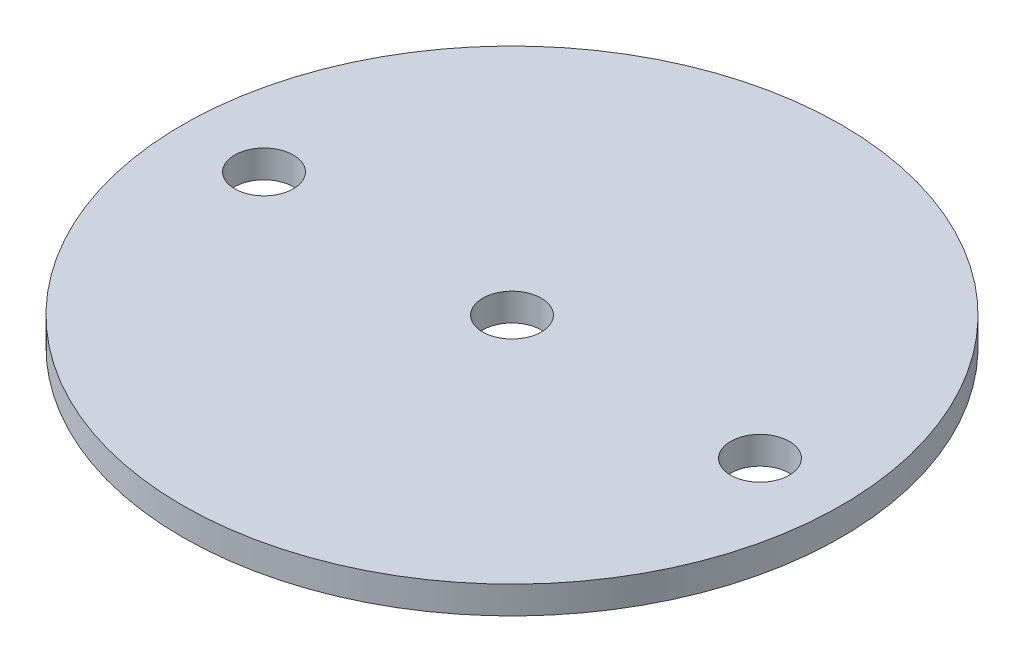
ISO-10303-21;
HEADER;
FILE_DESCRIPTION(('STEP AP214'),'2;1');
FILE_NAME('part.step','',(''),(''),'','','');
FILE_SCHEMA(('AUTOMOTIVE_DESIGN { 1 0 10303 214 1 1 1 1 }'));
ENDSEC;
DATA;
#1=APPLICATION_CONTEXT('core data for automotive mechanical design processes');
#2=APPLICATION_PROTOCOL_DEFINITION('international standard','automotive_design',2000,#1);
#3=PRODUCT_CONTEXT('',#1,'mechanical');
#4=PRODUCT('Part','Part','',(#3));
#5=PRODUCT_RELATED_PRODUCT_CATEGORY('part','',(#4));
#6=PRODUCT_DEFINITION_FORMATION('','',#4);
#7=PRODUCT_DEFINITION_CONTEXT('part definition',#1,'design');
#8=PRODUCT_DEFINITION('design','',#6,#7);
#9=PRODUCT_DEFINITION_SHAPE('','',#8);
#10=(LENGTH_UNIT() NAMED_UNIT(*) SI_UNIT(.MILLI.,.METRE.));
#11=(NAMED_UNIT(*) PLANE_ANGLE_UNIT() SI_UNIT($,.RADIAN.));
#12=(NAMED_UNIT(*) SI_UNIT($,.STERADIAN.) SOLID_ANGLE_UNIT());
#13=UNCERTAINTY_MEASURE_WITH_UNIT(LENGTH_MEASURE(1.E-05),#10,'distance_accuracy_value','');
#14=(GEOMETRIC_REPRESENTATION_CONTEXT(3) GLOBAL_UNCERTAINTY_ASSIGNED_CONTEXT((#13)) GLOBAL_UNIT_ASSIGNED_CONTEXT((#10,
#11,#12)) REPRESENTATION_CONTEXT('',''));
#15=CARTESIAN_POINT('',(0.,0.,0.));
#16=DIRECTION('',(0.,0.,1.));
#17=DIRECTION('',(1.,0.,0.));
#18=AXIS2_PLACEMENT_3D('',#15,#16,#17);
#19=CARTESIAN_POINT('',(0.,1.5875,0.));
#20=DIRECTION('',(0.,-1.,0.));
#21=DIRECTION('',(0.,0.,-1.));
#22=AXIS2_PLACEMENT_3D('',#19,#20,#21);
#23=CYLINDRICAL_SURFACE('',#22,37.973);
#24=CARTESIAN_POINT('',(0.,1.5875,0.));
#25=DIRECTION('',(0.,1.,0.));
#26=DIRECTION('',(0.,0.,1.));
#27=AXIS2_PLACEMENT_3D('',#24,#25,#26);
#28=CIRCLE('',#27,37.973);
#29=CARTESIAN_POINT('',(0.,1.5875,37.973));
#30=VERTEX_POINT('',#29);
#31=EDGE_CURVE('E10',#30,#30,#28,.T.);
#32=ORIENTED_EDGE('',*,*,#31,.F.);
#33=EDGE_LOOP('',(#32));
#34=FACE_BOUND('',#33,.T.);
#35=CARTESIAN_POINT('',(0.,-1.5875,0.));
#36=DIRECTION('',(0.,1.,0.));
#37=DIRECTION('',(0.,0.,1.));
#38=AXIS2_PLACEMENT_3D('',#35,#36,#37);
#39=CIRCLE('',#38,37.973);
#40=CARTESIAN_POINT('',(0.,-1.5875,37.973));
#41=VERTEX_POINT('',#40);
#42=EDGE_CURVE('E42',#41,#41,#39,.T.);
#43=ORIENTED_EDGE('',*,*,#42,.T.);
#44=EDGE_LOOP('',(#43));
#45=FACE_BOUND('',#44,.T.);
#46=ADVANCED_FACE('F39',(#34,#45),#23,.T.);
#47=CARTESIAN_POINT('',(0.,1.5875,0.));
#48=DIRECTION('',(0.,1.,0.));
#49=DIRECTION('',(0.,0.,1.));
#50=AXIS2_PLACEMENT_3D('',#47,#48,#49);
#51=PLANE('',#50);
#52=CARTESIAN_POINT('',(0.,1.5875,0.));
#53=DIRECTION('',(0.,1.,0.));
#54=DIRECTION('',(0.,0.,1.));
#55=AXIS2_PLACEMENT_3D('',#52,#53,#54);
#56=CIRCLE('',#55,3.3782);
#57=CARTESIAN_POINT('',(0.,1.5875,3.3782));
#58=VERTEX_POINT('',#57);
#59=EDGE_CURVE('E72',#58,#58,#56,.T.);
#60=ORIENTED_EDGE('',*,*,#59,.F.);
#61=EDGE_LOOP('',(#60));
#62=FACE_BOUND('',#61,.T.);
#63=CARTESIAN_POINT('',(-28.575,1.5875,0.));
#64=DIRECTION('',(0.,1.,0.));
#65=DIRECTION('',(0.,0.,1.));
#66=AXIS2_PLACEMENT_3D('',#63,#64,#65);
#67=CIRCLE('',#66,3.37819999999999);
#68=CARTESIAN_POINT('',(-28.575,1.5875,3.37819999999999));
#69=VERTEX_POINT('',#68);
#70=EDGE_CURVE('E64',#69,#69,#67,.T.);
#71=ORIENTED_EDGE('',*,*,#70,.F.);
#72=EDGE_LOOP('',(#71));
#73=FACE_BOUND('',#72,.T.);
#74=CARTESIAN_POINT('',(28.575,1.5875,0.));
#75=DIRECTION('',(0.,1.,0.));
#76=DIRECTION('',(0.,0.,1.));
#77=AXIS2_PLACEMENT_3D('',#74,#75,#76);
#78=CIRCLE('',#77,3.37819999999999);
#79=CARTESIAN_POINT('',(28.575,1.5875,3.37819999999998));
#80=VERTEX_POINT('',#79);
#81=EDGE_CURVE('E56',#80,#80,#78,.T.);
#82=ORIENTED_EDGE('',*,*,#81,.F.);
#83=EDGE_LOOP('',(#82));
#84=FACE_BOUND('',#83,.T.);
#85=ORIENTED_EDGE('',*,*,#31,.T.);
#86=EDGE_LOOP('',(#85));
#87=FACE_BOUND('',#86,.T.);
#88=ADVANCED_FACE('F79',(#62,#73,#84,#87),#51,.T.);
#89=CARTESIAN_POINT('',(0.,-1.5875,0.));
#90=DIRECTION('',(0.,1.,0.));
#91=DIRECTION('',(0.,0.,1.));
#92=AXIS2_PLACEMENT_3D('',#89,#90,#91);
#93=PLANE('',#92);
#94=CARTESIAN_POINT('',(0.,-1.5875,0.));
#95=DIRECTION('',(0.,1.,0.));
#96=DIRECTION('',(0.,0.,1.));
#97=AXIS2_PLACEMENT_3D('',#94,#95,#96);
#98=CIRCLE('',#97,3.3782);
#99=CARTESIAN_POINT('',(0.,-1.5875,3.3782));
#100=VERTEX_POINT('',#99);
#101=EDGE_CURVE('E68',#100,#100,#98,.T.);
#102=ORIENTED_EDGE('',*,*,#101,.T.);
#103=EDGE_LOOP('',(#102));
#104=FACE_BOUND('',#103,.T.);
#105=CARTESIAN_POINT('',(-28.575,-1.5875,0.));
#106=DIRECTION('',(0.,1.,0.));
#107=DIRECTION('',(0.,0.,1.));
#108=AXIS2_PLACEMENT_3D('',#105,#106,#107);
#109=CIRCLE('',#108,3.3782);
#110=CARTESIAN_POINT('',(-28.575,-1.5875,3.3782));
#111=VERTEX_POINT('',#110);
#112=EDGE_CURVE('E60',#111,#111,#109,.T.);
#113=ORIENTED_EDGE('',*,*,#112,.T.);
#114=EDGE_LOOP('',(#113));
#115=FACE_BOUND('',#114,.T.);
#116=CARTESIAN_POINT('',(28.575,-1.5875,0.));
#117=DIRECTION('',(0.,1.,0.));
#118=DIRECTION('',(0.,0.,1.));
#119=AXIS2_PLACEMENT_3D('',#116,#117,#118);
#120=CIRCLE('',#119,3.3782);
#121=CARTESIAN_POINT('',(28.575,-1.5875,3.37819999999999));
#122=VERTEX_POINT('',#121);
#123=EDGE_CURVE('E51',#122,#122,#120,.T.);
#124=ORIENTED_EDGE('',*,*,#123,.T.);
#125=EDGE_LOOP('',(#124));
#126=FACE_BOUND('',#125,.T.);
#127=ORIENTED_EDGE('',*,*,#42,.F.);
#128=EDGE_LOOP('',(#127));
#129=FACE_BOUND('',#128,.T.);
#130=ADVANCED_FACE('F82',(#104,#115,#126,#129),#93,.F.);
#131=CARTESIAN_POINT('',(28.575,1.5875,0.));
#132=DIRECTION('',(0.,1.,0.));
#133=DIRECTION('',(0.,0.,1.));
#134=AXIS2_PLACEMENT_3D('',#131,#132,#133);
#135=CYLINDRICAL_SURFACE('',#134,3.37819999999999);
#136=ORIENTED_EDGE('',*,*,#123,.F.);
#137=EDGE_LOOP('',(#136));
#138=FACE_BOUND('',#137,.T.);
#139=ORIENTED_EDGE('',*,*,#81,.T.);
#140=EDGE_LOOP('',(#139));
#141=FACE_BOUND('',#140,.T.);
#142=ADVANCED_FACE('F88',(#138,#141),#135,.F.);
#143=CARTESIAN_POINT('',(-28.575,1.5875,0.));
#144=DIRECTION('',(0.,1.,0.));
#145=DIRECTION('',(0.,0.,1.));
#146=AXIS2_PLACEMENT_3D('',#143,#144,#145);
#147=CYLINDRICAL_SURFACE('',#146,3.37819999999999);
#148=ORIENTED_EDGE('',*,*,#112,.F.);
#149=EDGE_LOOP('',(#148));
#150=FACE_BOUND('',#149,.T.);
#151=ORIENTED_EDGE('',*,*,#70,.T.);
#152=EDGE_LOOP('',(#151));
#153=FACE_BOUND('',#152,.T.);
#154=ADVANCED_FACE('F90',(#150,#153),#147,.F.);
#155=CARTESIAN_POINT('',(0.,1.5875,0.));
#156=DIRECTION('',(0.,1.,0.));
#157=DIRECTION('',(0.,0.,1.));
#158=AXIS2_PLACEMENT_3D('',#155,#156,#157);
#159=CYLINDRICAL_SURFACE('',#158,3.3782);
#160=ORIENTED_EDGE('',*,*,#101,.F.);
#161=EDGE_LOOP('',(#160));
#162=FACE_BOUND('',#161,.T.);
#163=ORIENTED_EDGE('',*,*,#59,.T.);
#164=EDGE_LOOP('',(#163));
#165=FACE_BOUND('',#164,.T.);
#166=ADVANCED_FACE('F77',(#162,#165),#159,.F.);
#167=CLOSED_SHELL('',(#46,#88,#130,#142,#154,#166));
#168=MANIFOLD_SOLID_BREP('B2',#167);
#169=ADVANCED_BREP_SHAPE_REPRESENTATION('',(#18,#168),#14);
#170=SHAPE_DEFINITION_REPRESENTATION(#9,#169);
ENDSEC;
END-ISO-10303-21;
